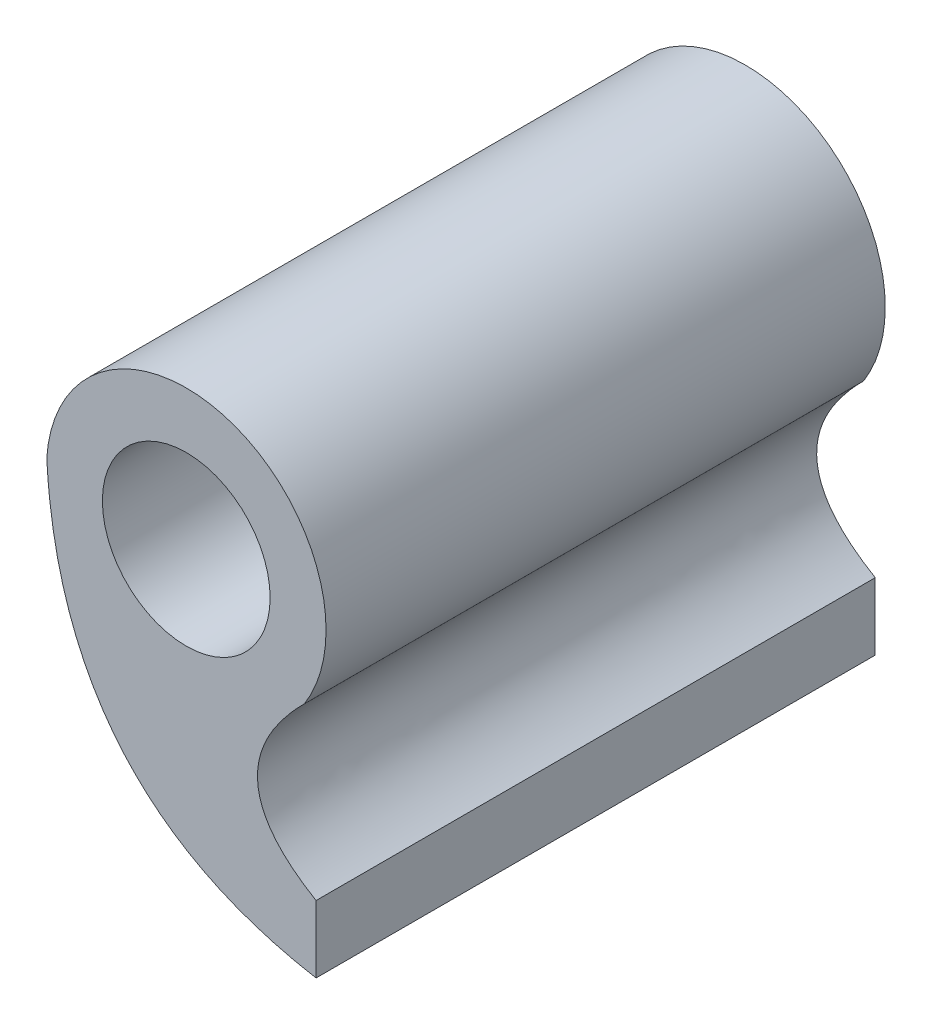
ISO-10303-21;
HEADER;
FILE_DESCRIPTION(('STEP AP214'),'2;1');
FILE_NAME('part.step','',(''),(''),'','','');
FILE_SCHEMA(('AUTOMOTIVE_DESIGN { 1 0 10303 214 1 1 1 1 }'));
ENDSEC;
DATA;
#1=APPLICATION_CONTEXT('core data for automotive mechanical design processes');
#2=APPLICATION_PROTOCOL_DEFINITION('international standard','automotive_design',2000,#1);
#3=PRODUCT_CONTEXT('',#1,'mechanical');
#4=PRODUCT('Part','Part','',(#3));
#5=PRODUCT_RELATED_PRODUCT_CATEGORY('part','',(#4));
#6=PRODUCT_DEFINITION_FORMATION('','',#4);
#7=PRODUCT_DEFINITION_CONTEXT('part definition',#1,'design');
#8=PRODUCT_DEFINITION('design','',#6,#7);
#9=PRODUCT_DEFINITION_SHAPE('','',#8);
#10=(LENGTH_UNIT() NAMED_UNIT(*) SI_UNIT(.MILLI.,.METRE.));
#11=(NAMED_UNIT(*) PLANE_ANGLE_UNIT() SI_UNIT($,.RADIAN.));
#12=(NAMED_UNIT(*) SI_UNIT($,.STERADIAN.) SOLID_ANGLE_UNIT());
#13=UNCERTAINTY_MEASURE_WITH_UNIT(LENGTH_MEASURE(1.E-05),#10,'distance_accuracy_value','');
#14=(GEOMETRIC_REPRESENTATION_CONTEXT(3) GLOBAL_UNCERTAINTY_ASSIGNED_CONTEXT((#13)) GLOBAL_UNIT_ASSIGNED_CONTEXT((#10,
#11,#12)) REPRESENTATION_CONTEXT('',''));
#15=CARTESIAN_POINT('',(0.,0.,0.));
#16=DIRECTION('',(0.,0.,1.));
#17=DIRECTION('',(1.,0.,0.));
#18=AXIS2_PLACEMENT_3D('',#15,#16,#17);
#19=CARTESIAN_POINT('',(0.,0.,100.));
#20=CARTESIAN_POINT('',(-30.3671388557966,5.30064834463664,100.));
#21=CARTESIAN_POINT('',(-46.4201712359905,24.1092812672438,100.));
#22=CARTESIAN_POINT('',(-48.1590971405673,56.4258987675528,100.));
#23=B_SPLINE_CURVE_WITH_KNOTS('',3,(#19,#20,#21,#22),.UNSPECIFIED.,.F.,.F.,(4,4),(0.,
0.900807751892253),.UNSPECIFIED.);
#24=DIRECTION('',(0.,0.,-1.));
#25=VECTOR('',#24,1.);
#26=SURFACE_OF_LINEAR_EXTRUSION('',#23,#25);
#27=CARTESIAN_POINT('',(0.,0.,0.));
#28=CARTESIAN_POINT('',(-30.3671388557966,5.30064834463664,0.));
#29=CARTESIAN_POINT('',(-46.4201712359905,24.1092812672438,0.));
#30=CARTESIAN_POINT('',(-48.1590971405673,56.4258987675528,0.));
#31=B_SPLINE_CURVE_WITH_KNOTS('',3,(#27,#28,#29,#30),.UNSPECIFIED.,.F.,.F.,(4,4),(0.,
0.900807751892253),.UNSPECIFIED.);
#32=CARTESIAN_POINT('',(0.,0.,0.));
#33=VERTEX_POINT('',#32);
#34=CARTESIAN_POINT('',(-48.1590971405673,56.4258987675528,0.));
#35=VERTEX_POINT('',#34);
#36=EDGE_CURVE('E121',#33,#35,#31,.T.);
#37=ORIENTED_EDGE('',*,*,#36,.F.);
#38=DIRECTION('',(0.,0.,-1.));
#39=VECTOR('',#38,1.);
#40=CARTESIAN_POINT('',(0.,0.,100.));
#41=LINE('',#40,#39);
#42=CARTESIAN_POINT('',(0.,0.,100.));
#43=VERTEX_POINT('',#42);
#44=EDGE_CURVE('E11',#43,#33,#41,.T.);
#45=ORIENTED_EDGE('',*,*,#44,.F.);
#46=CARTESIAN_POINT('',(-48.1590971405673,56.4258987675528,100.));
#47=VERTEX_POINT('',#46);
#48=EDGE_CURVE('E91',#43,#47,#23,.T.);
#49=ORIENTED_EDGE('',*,*,#48,.T.);
#50=DIRECTION('',(0.,0.,-1.));
#51=VECTOR('',#50,1.);
#52=CARTESIAN_POINT('',(-48.1590971405673,56.4258987675528,100.));
#53=LINE('',#52,#51);
#54=EDGE_CURVE('E79',#47,#35,#53,.T.);
#55=ORIENTED_EDGE('',*,*,#54,.T.);
#56=EDGE_LOOP('',(#37,#45,#49,#55));
#57=FACE_BOUND('',#56,.T.);
#58=ADVANCED_FACE('F39',(#57),#26,.T.);
#59=CARTESIAN_POINT('',(0.,-33.4866832660299,100.));
#60=DIRECTION('',(-1.,0.,0.));
#61=DIRECTION('',(0.,0.,1.));
#62=AXIS2_PLACEMENT_3D('',#59,#60,#61);
#63=PLANE('',#62);
#64=DIRECTION('',(0.,1.,0.));
#65=VECTOR('',#64,1.);
#66=CARTESIAN_POINT('',(0.,-33.4866832660299,0.));
#67=LINE('',#66,#65);
#68=CARTESIAN_POINT('',(0.,12.,0.));
#69=VERTEX_POINT('',#68);
#70=EDGE_CURVE('E96',#33,#69,#67,.T.);
#71=ORIENTED_EDGE('',*,*,#70,.T.);
#72=DIRECTION('',(0.,0.,-1.));
#73=VECTOR('',#72,1.);
#74=CARTESIAN_POINT('',(0.,12.,100.));
#75=LINE('',#74,#73);
#76=CARTESIAN_POINT('',(0.,12.,100.));
#77=VERTEX_POINT('',#76);
#78=EDGE_CURVE('E48',#77,#69,#75,.T.);
#79=ORIENTED_EDGE('',*,*,#78,.F.);
#80=DIRECTION('',(0.,1.,0.));
#81=VECTOR('',#80,1.);
#82=CARTESIAN_POINT('',(0.,-33.4866832660299,100.));
#83=LINE('',#82,#81);
#84=EDGE_CURVE('E85',#43,#77,#83,.T.);
#85=ORIENTED_EDGE('',*,*,#84,.F.);
#86=ORIENTED_EDGE('',*,*,#44,.T.);
#87=EDGE_LOOP('',(#71,#79,#85,#86));
#88=FACE_BOUND('',#87,.T.);
#89=ADVANCED_FACE('F94',(#88),#63,.F.);
#90=CARTESIAN_POINT('',(0.,12.,100.));
#91=CARTESIAN_POINT('',(-19.8555064590469,23.7011383212253,100.));
#92=CARTESIAN_POINT('',(-2.07892169603872,41.4322766625246,100.));
#93=B_SPLINE_CURVE_WITH_KNOTS('',2,(#90,#91,#92),.UNSPECIFIED.,.F.,.F.,(3,3),(0.,1.),.UNSPECIFIED.);
#94=DIRECTION('',(0.,0.,-1.));
#95=VECTOR('',#94,1.);
#96=SURFACE_OF_LINEAR_EXTRUSION('',#93,#95);
#97=CARTESIAN_POINT('',(0.,12.,0.));
#98=CARTESIAN_POINT('',(-19.8555064590469,23.7011383212253,0.));
#99=CARTESIAN_POINT('',(-2.07892169603872,41.4322766625246,0.));
#100=B_SPLINE_CURVE_WITH_KNOTS('',2,(#97,#98,#99),.UNSPECIFIED.,.F.,.F.,(3,3),(0.,1.),.UNSPECIFIED.);
#101=CARTESIAN_POINT('',(-2.07892169603873,41.4322766625246,0.));
#102=VERTEX_POINT('',#101);
#103=EDGE_CURVE('E72',#69,#102,#100,.T.);
#104=ORIENTED_EDGE('',*,*,#103,.T.);
#105=DIRECTION('',(0.,0.,-1.));
#106=VECTOR('',#105,1.);
#107=CARTESIAN_POINT('',(-2.07892169603873,41.4322766625246,100.));
#108=LINE('',#107,#106);
#109=CARTESIAN_POINT('',(-2.07892169603873,41.4322766625246,100.));
#110=VERTEX_POINT('',#109);
#111=EDGE_CURVE('E97',#110,#102,#108,.T.);
#112=ORIENTED_EDGE('',*,*,#111,.F.);
#113=EDGE_CURVE('E90',#77,#110,#93,.T.);
#114=ORIENTED_EDGE('',*,*,#113,.F.);
#115=ORIENTED_EDGE('',*,*,#78,.T.);
#116=EDGE_LOOP('',(#104,#112,#114,#115));
#117=FACE_BOUND('',#116,.T.);
#118=ADVANCED_FACE('F98',(#117),#96,.F.);
#119=CARTESIAN_POINT('',(-23.2128544745046,54.7873088719686,100.));
#120=DIRECTION('',(0.,0.,-1.));
#121=DIRECTION('',(-1.,0.,0.));
#122=AXIS2_PLACEMENT_3D('',#119,#120,#121);
#123=CYLINDRICAL_SURFACE('',#122,25.);
#124=CARTESIAN_POINT('',(-23.2128544745046,54.7873088719686,0.));
#125=DIRECTION('',(0.,0.,1.));
#126=DIRECTION('',(1.,0.,0.));
#127=AXIS2_PLACEMENT_3D('',#124,#125,#126);
#128=CIRCLE('',#127,25.);
#129=EDGE_CURVE('E135',#102,#35,#128,.T.);
#130=ORIENTED_EDGE('',*,*,#129,.T.);
#131=ORIENTED_EDGE('',*,*,#54,.F.);
#132=CARTESIAN_POINT('',(-23.2128544745046,54.7873088719686,100.));
#133=DIRECTION('',(0.,0.,1.));
#134=DIRECTION('',(1.,0.,0.));
#135=AXIS2_PLACEMENT_3D('',#132,#133,#134);
#136=CIRCLE('',#135,25.);
#137=EDGE_CURVE('E56',#110,#47,#136,.T.);
#138=ORIENTED_EDGE('',*,*,#137,.F.);
#139=ORIENTED_EDGE('',*,*,#111,.T.);
#140=EDGE_LOOP('',(#130,#131,#138,#139));
#141=FACE_BOUND('',#140,.T.);
#142=ADVANCED_FACE('F112',(#141),#123,.T.);
#143=CARTESIAN_POINT('',(-23.2128544745046,54.7873088719686,100.));
#144=DIRECTION('',(0.,0.,-1.));
#145=DIRECTION('',(-1.,0.,0.));
#146=AXIS2_PLACEMENT_3D('',#143,#144,#145);
#147=CYLINDRICAL_SURFACE('',#146,14.9999999999793);
#148=CARTESIAN_POINT('',(-23.2128544745046,54.7873088719686,100.));
#149=DIRECTION('',(0.,0.,1.));
#150=DIRECTION('',(1.,0.,0.));
#151=AXIS2_PLACEMENT_3D('',#148,#149,#150);
#152=CIRCLE('',#151,14.9999999999793);
#153=CARTESIAN_POINT('',(-8.21285447452527,54.7873088719686,100.));
#154=VERTEX_POINT('',#153);
#155=EDGE_CURVE('E100',#154,#154,#152,.T.);
#156=ORIENTED_EDGE('',*,*,#155,.T.);
#157=EDGE_LOOP('',(#156));
#158=FACE_BOUND('',#157,.T.);
#159=CARTESIAN_POINT('',(-23.2128544745046,54.7873088719686,0.));
#160=DIRECTION('',(0.,0.,1.));
#161=DIRECTION('',(1.,0.,0.));
#162=AXIS2_PLACEMENT_3D('',#159,#160,#161);
#163=CIRCLE('',#162,14.9999999999793);
#164=CARTESIAN_POINT('',(-8.21285447452527,54.7873088719686,0.));
#165=VERTEX_POINT('',#164);
#166=EDGE_CURVE('E140',#165,#165,#163,.T.);
#167=ORIENTED_EDGE('',*,*,#166,.F.);
#168=EDGE_LOOP('',(#167));
#169=FACE_BOUND('',#168,.T.);
#170=ADVANCED_FACE('F151',(#158,#169),#147,.F.);
#171=CARTESIAN_POINT('',(-23.2128544745046,-33.4866832660299,100.));
#172=DIRECTION('',(0.,0.,1.));
#173=DIRECTION('',(1.,0.,0.));
#174=AXIS2_PLACEMENT_3D('',#171,#172,#173);
#175=PLANE('',#174);
#176=ORIENTED_EDGE('',*,*,#48,.F.);
#177=ORIENTED_EDGE('',*,*,#84,.T.);
#178=ORIENTED_EDGE('',*,*,#113,.T.);
#179=ORIENTED_EDGE('',*,*,#137,.T.);
#180=EDGE_LOOP('',(#176,#177,#178,#179));
#181=FACE_BOUND('',#180,.T.);
#182=ORIENTED_EDGE('',*,*,#155,.F.);
#183=EDGE_LOOP('',(#182));
#184=FACE_BOUND('',#183,.T.);
#185=ADVANCED_FACE('F87',(#181,#184),#175,.T.);
#186=CARTESIAN_POINT('',(-23.2128544745046,-33.4866832660299,0.));
#187=DIRECTION('',(0.,0.,1.));
#188=DIRECTION('',(1.,0.,0.));
#189=AXIS2_PLACEMENT_3D('',#186,#187,#188);
#190=PLANE('',#189);
#191=ORIENTED_EDGE('',*,*,#36,.T.);
#192=ORIENTED_EDGE('',*,*,#129,.F.);
#193=ORIENTED_EDGE('',*,*,#103,.F.);
#194=ORIENTED_EDGE('',*,*,#70,.F.);
#195=EDGE_LOOP('',(#191,#192,#193,#194));
#196=FACE_BOUND('',#195,.T.);
#197=ORIENTED_EDGE('',*,*,#166,.T.);
#198=EDGE_LOOP('',(#197));
#199=FACE_BOUND('',#198,.T.);
#200=ADVANCED_FACE('F145',(#196,#199),#190,.F.);
#201=CLOSED_SHELL('',(#58,#89,#118,#142,#170,#185,#200));
#202=MANIFOLD_SOLID_BREP('B2',#201);
#203=ADVANCED_BREP_SHAPE_REPRESENTATION('',(#18,#202),#14);
#204=SHAPE_DEFINITION_REPRESENTATION(#9,#203);
ENDSEC;
END-ISO-10303-21;
